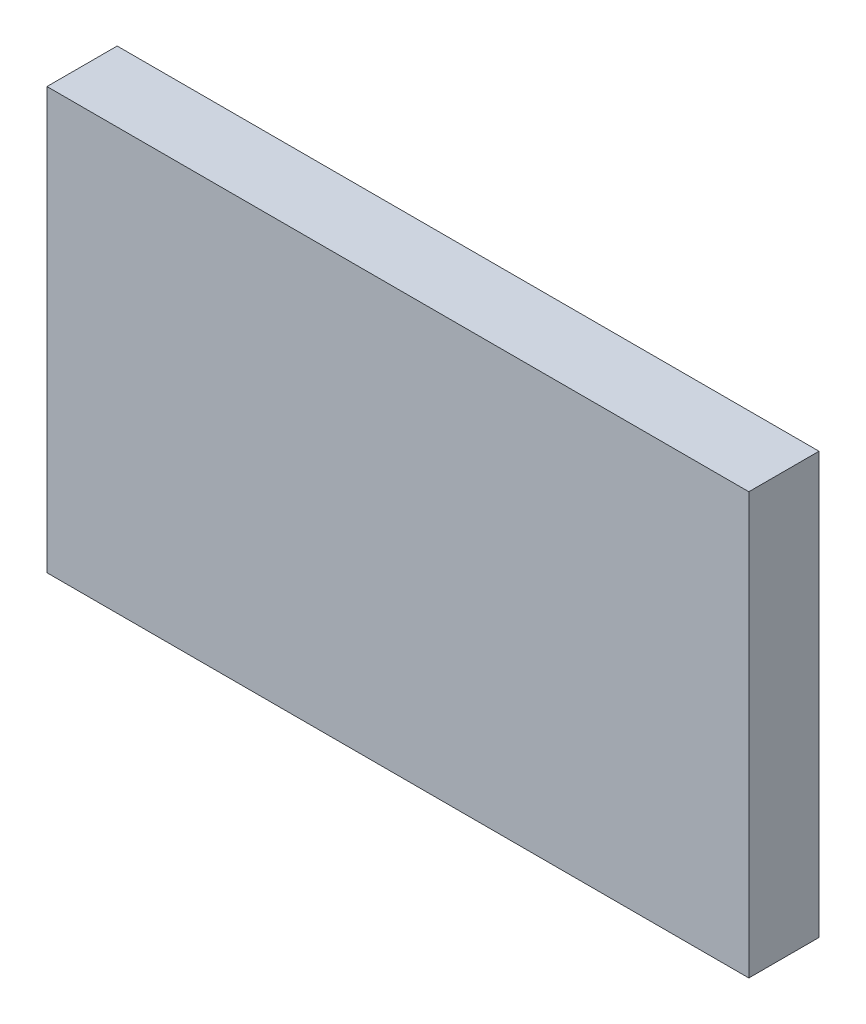
ISO-10303-21;
HEADER;
FILE_DESCRIPTION(('STEP AP214'),'2;1');
FILE_NAME('part.step','',(''),(''),'','','');
FILE_SCHEMA(('AUTOMOTIVE_DESIGN { 1 0 10303 214 1 1 1 1 }'));
ENDSEC;
DATA;
#1=APPLICATION_CONTEXT('core data for automotive mechanical design processes');
#2=APPLICATION_PROTOCOL_DEFINITION('international standard','automotive_design',2000,#1);
#3=PRODUCT_CONTEXT('',#1,'mechanical');
#4=PRODUCT('Part','Part','',(#3));
#5=PRODUCT_RELATED_PRODUCT_CATEGORY('part','',(#4));
#6=PRODUCT_DEFINITION_FORMATION('','',#4);
#7=PRODUCT_DEFINITION_CONTEXT('part definition',#1,'design');
#8=PRODUCT_DEFINITION('design','',#6,#7);
#9=PRODUCT_DEFINITION_SHAPE('','',#8);
#10=(LENGTH_UNIT() NAMED_UNIT(*) SI_UNIT(.MILLI.,.METRE.));
#11=(NAMED_UNIT(*) PLANE_ANGLE_UNIT() SI_UNIT($,.RADIAN.));
#12=(NAMED_UNIT(*) SI_UNIT($,.STERADIAN.) SOLID_ANGLE_UNIT());
#13=UNCERTAINTY_MEASURE_WITH_UNIT(LENGTH_MEASURE(1.E-05),#10,'distance_accuracy_value','');
#14=(GEOMETRIC_REPRESENTATION_CONTEXT(3) GLOBAL_UNCERTAINTY_ASSIGNED_CONTEXT((#13)) GLOBAL_UNIT_ASSIGNED_CONTEXT((#10,
#11,#12)) REPRESENTATION_CONTEXT('',''));
#15=CARTESIAN_POINT('',(0.,0.,0.));
#16=DIRECTION('',(0.,0.,1.));
#17=DIRECTION('',(1.,0.,0.));
#18=AXIS2_PLACEMENT_3D('',#15,#16,#17);
#19=CARTESIAN_POINT('',(0.,0.,-10000.));
#20=DIRECTION('',(-1.,0.,0.));
#21=DIRECTION('',(0.,0.,1.));
#22=AXIS2_PLACEMENT_3D('',#19,#20,#21);
#23=PLANE('',#22);
#24=DIRECTION('',(0.,-1.,0.));
#25=VECTOR('',#24,1.);
#26=CARTESIAN_POINT('',(0.,0.,0.));
#27=LINE('',#26,#25);
#28=CARTESIAN_POINT('',(0.,60000.,0.));
#29=VERTEX_POINT('',#28);
#30=CARTESIAN_POINT('',(0.,0.,0.));
#31=VERTEX_POINT('',#30);
#32=EDGE_CURVE('E104',#29,#31,#27,.T.);
#33=ORIENTED_EDGE('',*,*,#32,.F.);
#34=DIRECTION('',(0.,0.,1.));
#35=VECTOR('',#34,1.);
#36=CARTESIAN_POINT('',(0.,60000.,-10000.));
#37=LINE('',#36,#35);
#38=CARTESIAN_POINT('',(0.,60000.,-10000.));
#39=VERTEX_POINT('',#38);
#40=EDGE_CURVE('E11',#39,#29,#37,.T.);
#41=ORIENTED_EDGE('',*,*,#40,.F.);
#42=DIRECTION('',(0.,-1.,0.));
#43=VECTOR('',#42,1.);
#44=CARTESIAN_POINT('',(0.,0.,-10000.));
#45=LINE('',#44,#43);
#46=CARTESIAN_POINT('',(0.,0.,-10000.));
#47=VERTEX_POINT('',#46);
#48=EDGE_CURVE('E97',#39,#47,#45,.T.);
#49=ORIENTED_EDGE('',*,*,#48,.T.);
#50=DIRECTION('',(0.,0.,1.));
#51=VECTOR('',#50,1.);
#52=CARTESIAN_POINT('',(0.,0.,-10000.));
#53=LINE('',#52,#51);
#54=EDGE_CURVE('E42',#47,#31,#53,.T.);
#55=ORIENTED_EDGE('',*,*,#54,.T.);
#56=EDGE_LOOP('',(#33,#41,#49,#55));
#57=FACE_BOUND('',#56,.T.);
#58=ADVANCED_FACE('F41',(#57),#23,.T.);
#59=CARTESIAN_POINT('',(0.,60000.,-10000.));
#60=DIRECTION('',(0.,1.,0.));
#61=DIRECTION('',(0.,0.,1.));
#62=AXIS2_PLACEMENT_3D('',#59,#60,#61);
#63=PLANE('',#62);
#64=DIRECTION('',(-1.,0.,0.));
#65=VECTOR('',#64,1.);
#66=CARTESIAN_POINT('',(0.,60000.,0.));
#67=LINE('',#66,#65);
#68=CARTESIAN_POINT('',(100000.,60000.,0.));
#69=VERTEX_POINT('',#68);
#70=EDGE_CURVE('E101',#69,#29,#67,.T.);
#71=ORIENTED_EDGE('',*,*,#70,.F.);
#72=DIRECTION('',(0.,0.,1.));
#73=VECTOR('',#72,1.);
#74=CARTESIAN_POINT('',(100000.,60000.,-10000.));
#75=LINE('',#74,#73);
#76=CARTESIAN_POINT('',(100000.,60000.,-10000.));
#77=VERTEX_POINT('',#76);
#78=EDGE_CURVE('E49',#77,#69,#75,.T.);
#79=ORIENTED_EDGE('',*,*,#78,.F.);
#80=DIRECTION('',(-1.,0.,0.));
#81=VECTOR('',#80,1.);
#82=CARTESIAN_POINT('',(0.,60000.,-10000.));
#83=LINE('',#82,#81);
#84=EDGE_CURVE('E96',#77,#39,#83,.T.);
#85=ORIENTED_EDGE('',*,*,#84,.T.);
#86=ORIENTED_EDGE('',*,*,#40,.T.);
#87=EDGE_LOOP('',(#71,#79,#85,#86));
#88=FACE_BOUND('',#87,.T.);
#89=ADVANCED_FACE('F113',(#88),#63,.T.);
#90=CARTESIAN_POINT('',(100000.,0.,-10000.));
#91=DIRECTION('',(1.,0.,0.));
#92=DIRECTION('',(0.,0.,-1.));
#93=AXIS2_PLACEMENT_3D('',#90,#91,#92);
#94=PLANE('',#93);
#95=DIRECTION('',(0.,1.,0.));
#96=VECTOR('',#95,1.);
#97=CARTESIAN_POINT('',(100000.,0.,0.));
#98=LINE('',#97,#96);
#99=CARTESIAN_POINT('',(100000.,0.,0.));
#100=VERTEX_POINT('',#99);
#101=EDGE_CURVE('E93',#100,#69,#98,.T.);
#102=ORIENTED_EDGE('',*,*,#101,.F.);
#103=DIRECTION('',(0.,0.,1.));
#104=VECTOR('',#103,1.);
#105=CARTESIAN_POINT('',(100000.,0.,-10000.));
#106=LINE('',#105,#104);
#107=CARTESIAN_POINT('',(100000.,0.,-10000.));
#108=VERTEX_POINT('',#107);
#109=EDGE_CURVE('E88',#108,#100,#106,.T.);
#110=ORIENTED_EDGE('',*,*,#109,.F.);
#111=DIRECTION('',(0.,1.,0.));
#112=VECTOR('',#111,1.);
#113=CARTESIAN_POINT('',(100000.,0.,-10000.));
#114=LINE('',#113,#112);
#115=EDGE_CURVE('E90',#108,#77,#114,.T.);
#116=ORIENTED_EDGE('',*,*,#115,.T.);
#117=ORIENTED_EDGE('',*,*,#78,.T.);
#118=EDGE_LOOP('',(#102,#110,#116,#117));
#119=FACE_BOUND('',#118,.T.);
#120=ADVANCED_FACE('F86',(#119),#94,.T.);
#121=CARTESIAN_POINT('',(0.,0.,-10000.));
#122=DIRECTION('',(0.,-1.,0.));
#123=DIRECTION('',(0.,0.,-1.));
#124=AXIS2_PLACEMENT_3D('',#121,#122,#123);
#125=PLANE('',#124);
#126=DIRECTION('',(1.,0.,0.));
#127=VECTOR('',#126,1.);
#128=CARTESIAN_POINT('',(0.,0.,0.));
#129=LINE('',#128,#127);
#130=EDGE_CURVE('E107',#31,#100,#129,.T.);
#131=ORIENTED_EDGE('',*,*,#130,.F.);
#132=ORIENTED_EDGE('',*,*,#54,.F.);
#133=DIRECTION('',(1.,0.,0.));
#134=VECTOR('',#133,1.);
#135=CARTESIAN_POINT('',(0.,0.,-10000.));
#136=LINE('',#135,#134);
#137=EDGE_CURVE('E92',#47,#108,#136,.T.);
#138=ORIENTED_EDGE('',*,*,#137,.T.);
#139=ORIENTED_EDGE('',*,*,#109,.T.);
#140=EDGE_LOOP('',(#131,#132,#138,#139));
#141=FACE_BOUND('',#140,.T.);
#142=ADVANCED_FACE('F98',(#141),#125,.T.);
#143=CARTESIAN_POINT('',(0.,0.,-10000.));
#144=DIRECTION('',(0.,0.,-1.));
#145=DIRECTION('',(-1.,0.,0.));
#146=AXIS2_PLACEMENT_3D('',#143,#144,#145);
#147=PLANE('',#146);
#148=ORIENTED_EDGE('',*,*,#48,.F.);
#149=ORIENTED_EDGE('',*,*,#84,.F.);
#150=ORIENTED_EDGE('',*,*,#115,.F.);
#151=ORIENTED_EDGE('',*,*,#137,.F.);
#152=EDGE_LOOP('',(#148,#149,#150,#151));
#153=FACE_BOUND('',#152,.T.);
#154=ADVANCED_FACE('F94',(#153),#147,.T.);
#155=CARTESIAN_POINT('',(0.,0.,0.));
#156=DIRECTION('',(0.,0.,-1.));
#157=DIRECTION('',(-1.,0.,0.));
#158=AXIS2_PLACEMENT_3D('',#155,#156,#157);
#159=PLANE('',#158);
#160=ORIENTED_EDGE('',*,*,#32,.T.);
#161=ORIENTED_EDGE('',*,*,#130,.T.);
#162=ORIENTED_EDGE('',*,*,#101,.T.);
#163=ORIENTED_EDGE('',*,*,#70,.T.);
#164=EDGE_LOOP('',(#160,#161,#162,#163));
#165=FACE_BOUND('',#164,.T.);
#166=ADVANCED_FACE('F111',(#165),#159,.F.);
#167=CLOSED_SHELL('',(#58,#89,#120,#142,#154,#166));
#168=MANIFOLD_SOLID_BREP('B2',#167);
#169=ADVANCED_BREP_SHAPE_REPRESENTATION('',(#18,#168),#14);
#170=SHAPE_DEFINITION_REPRESENTATION(#9,#169);
ENDSEC;
END-ISO-10303-21;
